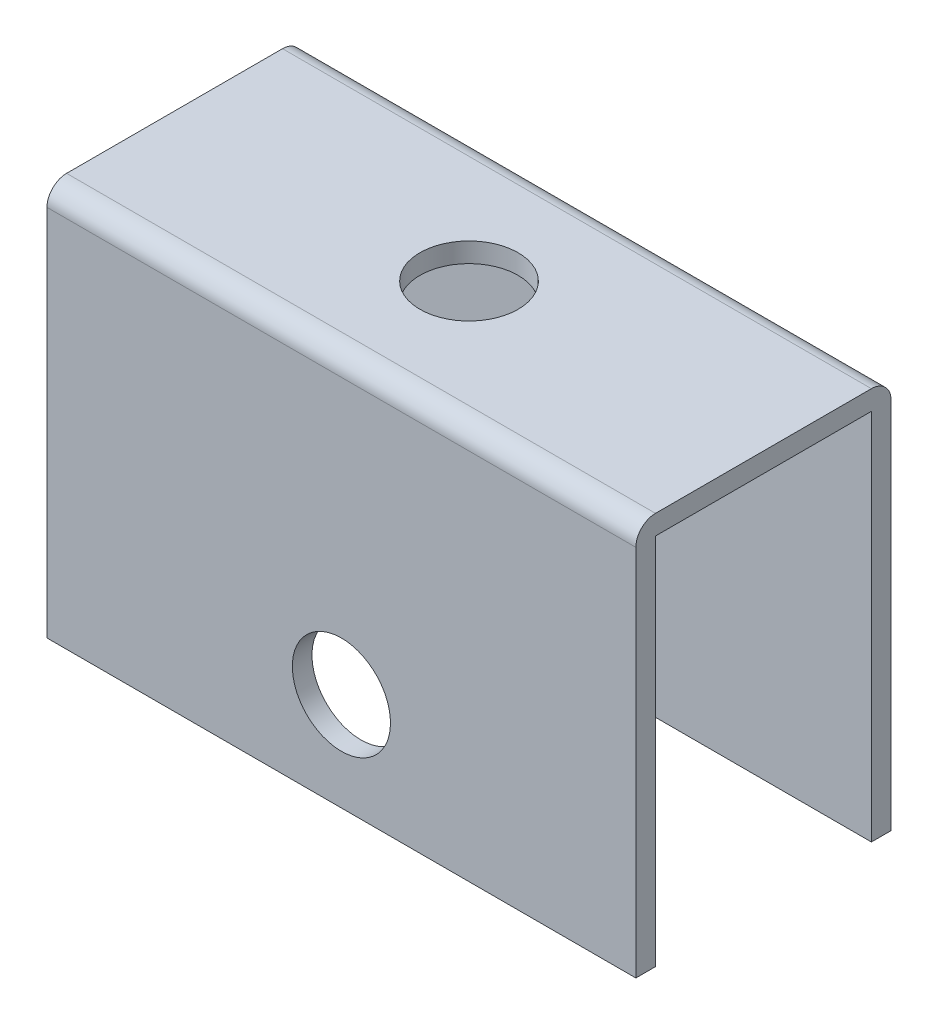
ISO-10303-21;
HEADER;
FILE_DESCRIPTION(('STEP AP214'),'2;1');
FILE_NAME('part.step','',(''),(''),'','','');
FILE_SCHEMA(('AUTOMOTIVE_DESIGN { 1 0 10303 214 1 1 1 1 }'));
ENDSEC;
DATA;
#1=APPLICATION_CONTEXT('core data for automotive mechanical design processes');
#2=APPLICATION_PROTOCOL_DEFINITION('international standard','automotive_design',2000,#1);
#3=PRODUCT_CONTEXT('',#1,'mechanical');
#4=PRODUCT('Part','Part','',(#3));
#5=PRODUCT_RELATED_PRODUCT_CATEGORY('part','',(#4));
#6=PRODUCT_DEFINITION_FORMATION('','',#4);
#7=PRODUCT_DEFINITION_CONTEXT('part definition',#1,'design');
#8=PRODUCT_DEFINITION('design','',#6,#7);
#9=PRODUCT_DEFINITION_SHAPE('','',#8);
#10=(LENGTH_UNIT() NAMED_UNIT(*) SI_UNIT(.MILLI.,.METRE.));
#11=(NAMED_UNIT(*) PLANE_ANGLE_UNIT() SI_UNIT($,.RADIAN.));
#12=(NAMED_UNIT(*) SI_UNIT($,.STERADIAN.) SOLID_ANGLE_UNIT());
#13=UNCERTAINTY_MEASURE_WITH_UNIT(LENGTH_MEASURE(1.E-05),#10,'distance_accuracy_value','');
#14=(GEOMETRIC_REPRESENTATION_CONTEXT(3) GLOBAL_UNCERTAINTY_ASSIGNED_CONTEXT((#13)) GLOBAL_UNIT_ASSIGNED_CONTEXT((#10,
#11,#12)) REPRESENTATION_CONTEXT('',''));
#15=CARTESIAN_POINT('',(0.,0.,0.));
#16=DIRECTION('',(0.,0.,1.));
#17=DIRECTION('',(1.,0.,0.));
#18=AXIS2_PLACEMENT_3D('',#15,#16,#17);
#19=CARTESIAN_POINT('',(-38.1,-25.4,33.02));
#20=DIRECTION('',(0.,1.,0.));
#21=DIRECTION('',(0.,0.,1.));
#22=AXIS2_PLACEMENT_3D('',#19,#20,#21);
#23=PLANE('',#22);
#24=DIRECTION('',(0.,0.,-1.));
#25=VECTOR('',#24,1.);
#26=CARTESIAN_POINT('',(-38.1,-25.4,33.02));
#27=LINE('',#26,#25);
#28=CARTESIAN_POINT('',(-38.1,-25.4,33.02));
#29=VERTEX_POINT('',#28);
#30=CARTESIAN_POINT('',(-38.1,-25.4,30.48));
#31=VERTEX_POINT('',#30);
#32=EDGE_CURVE('E215',#29,#31,#27,.T.);
#33=ORIENTED_EDGE('',*,*,#32,.T.);
#34=DIRECTION('',(1.,0.,0.));
#35=VECTOR('',#34,1.);
#36=CARTESIAN_POINT('',(-38.1,-25.4,30.48));
#37=LINE('',#36,#35);
#38=CARTESIAN_POINT('',(38.1,-25.4,30.48));
#39=VERTEX_POINT('',#38);
#40=EDGE_CURVE('E179',#31,#39,#37,.T.);
#41=ORIENTED_EDGE('',*,*,#40,.T.);
#42=DIRECTION('',(0.,0.,-1.));
#43=VECTOR('',#42,1.);
#44=CARTESIAN_POINT('',(38.1,-25.4,33.02));
#45=LINE('',#44,#43);
#46=CARTESIAN_POINT('',(38.1,-25.4,33.02));
#47=VERTEX_POINT('',#46);
#48=EDGE_CURVE('E211',#47,#39,#45,.T.);
#49=ORIENTED_EDGE('',*,*,#48,.F.);
#50=DIRECTION('',(1.,0.,0.));
#51=VECTOR('',#50,1.);
#52=CARTESIAN_POINT('',(-38.1,-25.4,33.02));
#53=LINE('',#52,#51);
#54=EDGE_CURVE('E199',#29,#47,#53,.T.);
#55=ORIENTED_EDGE('',*,*,#54,.F.);
#56=EDGE_LOOP('',(#33,#41,#49,#55));
#57=FACE_BOUND('',#56,.T.);
#58=ADVANCED_FACE('F47',(#57),#23,.F.);
#59=CARTESIAN_POINT('',(0.,-12.7,33.02));
#60=DIRECTION('',(0.,0.,-1.));
#61=DIRECTION('',(-1.,0.,0.));
#62=AXIS2_PLACEMENT_3D('',#59,#60,#61);
#63=CYLINDRICAL_SURFACE('',#62,6.35);
#64=CARTESIAN_POINT('',(0.,-12.7,30.48));
#65=DIRECTION('',(0.,0.,1.));
#66=DIRECTION('',(1.,0.,0.));
#67=AXIS2_PLACEMENT_3D('',#64,#65,#66);
#68=CIRCLE('',#67,6.35);
#69=CARTESIAN_POINT('',(6.35,-12.7,30.48));
#70=VERTEX_POINT('',#69);
#71=EDGE_CURVE('E178',#70,#70,#68,.T.);
#72=ORIENTED_EDGE('',*,*,#71,.F.);
#73=EDGE_LOOP('',(#72));
#74=FACE_BOUND('',#73,.T.);
#75=CARTESIAN_POINT('',(0.,-12.7,33.02));
#76=DIRECTION('',(0.,0.,1.));
#77=DIRECTION('',(1.,0.,0.));
#78=AXIS2_PLACEMENT_3D('',#75,#76,#77);
#79=CIRCLE('',#78,6.35);
#80=CARTESIAN_POINT('',(6.35,-12.7,33.02));
#81=VERTEX_POINT('',#80);
#82=EDGE_CURVE('E184',#81,#81,#79,.T.);
#83=ORIENTED_EDGE('',*,*,#82,.T.);
#84=EDGE_LOOP('',(#83));
#85=FACE_BOUND('',#84,.T.);
#86=ADVANCED_FACE('F339',(#74,#85),#63,.F.);
#87=CARTESIAN_POINT('',(0.,0.,33.02));
#88=DIRECTION('',(0.,0.,1.));
#89=DIRECTION('',(1.,0.,0.));
#90=AXIS2_PLACEMENT_3D('',#87,#88,#89);
#91=PLANE('',#90);
#92=DIRECTION('',(0.,1.,0.));
#93=VECTOR('',#92,1.);
#94=CARTESIAN_POINT('',(38.1,25.4,33.02));
#95=LINE('',#94,#93);
#96=CARTESIAN_POINT('',(38.1,22.86,33.02));
#97=VERTEX_POINT('',#96);
#98=EDGE_CURVE('E192',#47,#97,#95,.T.);
#99=ORIENTED_EDGE('',*,*,#98,.T.);
#100=DIRECTION('',(-1.,0.,0.));
#101=VECTOR('',#100,1.);
#102=CARTESIAN_POINT('',(-38.1,22.86,33.02));
#103=LINE('',#102,#101);
#104=CARTESIAN_POINT('',(-38.1,22.86,33.02));
#105=VERTEX_POINT('',#104);
#106=EDGE_CURVE('E11',#97,#105,#103,.T.);
#107=ORIENTED_EDGE('',*,*,#106,.T.);
#108=DIRECTION('',(0.,-1.,0.));
#109=VECTOR('',#108,1.);
#110=CARTESIAN_POINT('',(-38.1,25.4,33.02));
#111=LINE('',#110,#109);
#112=EDGE_CURVE('E195',#105,#29,#111,.T.);
#113=ORIENTED_EDGE('',*,*,#112,.T.);
#114=ORIENTED_EDGE('',*,*,#54,.T.);
#115=EDGE_LOOP('',(#99,#107,#113,#114));
#116=FACE_BOUND('',#115,.T.);
#117=ORIENTED_EDGE('',*,*,#82,.F.);
#118=EDGE_LOOP('',(#117));
#119=FACE_BOUND('',#118,.T.);
#120=ADVANCED_FACE('F345',(#116,#119),#91,.T.);
#121=CARTESIAN_POINT('',(0.,0.,0.));
#122=DIRECTION('',(0.,0.,1.));
#123=DIRECTION('',(1.,0.,0.));
#124=AXIS2_PLACEMENT_3D('',#121,#122,#123);
#125=PLANE('',#124);
#126=DIRECTION('',(0.,-1.,0.));
#127=VECTOR('',#126,1.);
#128=CARTESIAN_POINT('',(-38.1,25.4,0.));
#129=LINE('',#128,#127);
#130=CARTESIAN_POINT('',(-38.1,22.86,0.));
#131=VERTEX_POINT('',#130);
#132=CARTESIAN_POINT('',(-38.1,-25.4,0.));
#133=VERTEX_POINT('',#132);
#134=EDGE_CURVE('E205',#131,#133,#129,.T.);
#135=ORIENTED_EDGE('',*,*,#134,.F.);
#136=DIRECTION('',(-1.,0.,0.));
#137=VECTOR('',#136,1.);
#138=CARTESIAN_POINT('',(0.,22.86,0.));
#139=LINE('',#138,#137);
#140=CARTESIAN_POINT('',(38.1,22.86,0.));
#141=VERTEX_POINT('',#140);
#142=EDGE_CURVE('E71',#131,#141,#139,.F.);
#143=ORIENTED_EDGE('',*,*,#142,.T.);
#144=DIRECTION('',(0.,1.,0.));
#145=VECTOR('',#144,1.);
#146=CARTESIAN_POINT('',(38.1,25.4,0.));
#147=LINE('',#146,#145);
#148=CARTESIAN_POINT('',(38.1,-25.4,0.));
#149=VERTEX_POINT('',#148);
#150=EDGE_CURVE('E188',#149,#141,#147,.T.);
#151=ORIENTED_EDGE('',*,*,#150,.F.);
#152=DIRECTION('',(1.,0.,0.));
#153=VECTOR('',#152,1.);
#154=CARTESIAN_POINT('',(-38.1,-25.4,0.));
#155=LINE('',#154,#153);
#156=EDGE_CURVE('E196',#133,#149,#155,.T.);
#157=ORIENTED_EDGE('',*,*,#156,.F.);
#158=EDGE_LOOP('',(#135,#143,#151,#157));
#159=FACE_BOUND('',#158,.T.);
#160=CARTESIAN_POINT('',(0.,-12.7,0.));
#161=DIRECTION('',(0.,0.,1.));
#162=DIRECTION('',(1.,0.,0.));
#163=AXIS2_PLACEMENT_3D('',#160,#161,#162);
#164=CIRCLE('',#163,6.35);
#165=CARTESIAN_POINT('',(6.35,-12.7,0.));
#166=VERTEX_POINT('',#165);
#167=EDGE_CURVE('E183',#166,#166,#164,.T.);
#168=ORIENTED_EDGE('',*,*,#167,.T.);
#169=EDGE_LOOP('',(#168));
#170=FACE_BOUND('',#169,.T.);
#171=ADVANCED_FACE('F260',(#159,#170),#125,.F.);
#172=CARTESIAN_POINT('',(38.1,25.4,33.02));
#173=DIRECTION('',(-1.,0.,0.));
#174=DIRECTION('',(0.,-1.,0.));
#175=AXIS2_PLACEMENT_3D('',#172,#173,#174);
#176=PLANE('',#175);
#177=ORIENTED_EDGE('',*,*,#150,.T.);
#178=CARTESIAN_POINT('',(38.1,22.86,2.54));
#179=DIRECTION('',(-1.,0.,0.));
#180=DIRECTION('',(0.,-1.,0.));
#181=AXIS2_PLACEMENT_3D('',#178,#179,#180);
#182=CIRCLE('',#181,2.54);
#183=CARTESIAN_POINT('',(38.1,25.4,2.54));
#184=VERTEX_POINT('',#183);
#185=EDGE_CURVE('E56',#141,#184,#182,.F.);
#186=ORIENTED_EDGE('',*,*,#185,.T.);
#187=DIRECTION('',(0.,0.,-1.));
#188=VECTOR('',#187,1.);
#189=CARTESIAN_POINT('',(38.1,25.4,33.02));
#190=LINE('',#189,#188);
#191=CARTESIAN_POINT('',(38.1,25.4,30.48));
#192=VERTEX_POINT('',#191);
#193=EDGE_CURVE('E222',#192,#184,#190,.T.);
#194=ORIENTED_EDGE('',*,*,#193,.F.);
#195=CARTESIAN_POINT('',(38.1,22.86,30.48));
#196=DIRECTION('',(-1.,0.,0.));
#197=DIRECTION('',(0.,-1.,0.));
#198=AXIS2_PLACEMENT_3D('',#195,#196,#197);
#199=CIRCLE('',#198,2.54);
#200=EDGE_CURVE('E63',#192,#97,#199,.F.);
#201=ORIENTED_EDGE('',*,*,#200,.T.);
#202=ORIENTED_EDGE('',*,*,#98,.F.);
#203=ORIENTED_EDGE('',*,*,#48,.T.);
#204=DIRECTION('',(0.,-1.,0.));
#205=VECTOR('',#204,1.);
#206=CARTESIAN_POINT('',(38.1,22.86,30.48));
#207=LINE('',#206,#205);
#208=CARTESIAN_POINT('',(38.1,22.86,30.48));
#209=VERTEX_POINT('',#208);
#210=EDGE_CURVE('E164',#209,#39,#207,.T.);
#211=ORIENTED_EDGE('',*,*,#210,.F.);
#212=DIRECTION('',(0.,0.,1.));
#213=VECTOR('',#212,1.);
#214=CARTESIAN_POINT('',(38.1,22.86,2.54));
#215=LINE('',#214,#213);
#216=CARTESIAN_POINT('',(38.1,22.86,2.54));
#217=VERTEX_POINT('',#216);
#218=EDGE_CURVE('E160',#217,#209,#215,.T.);
#219=ORIENTED_EDGE('',*,*,#218,.F.);
#220=DIRECTION('',(0.,1.,0.));
#221=VECTOR('',#220,1.);
#222=CARTESIAN_POINT('',(38.1,-38.1,2.54));
#223=LINE('',#222,#221);
#224=CARTESIAN_POINT('',(38.1,-25.4,2.54));
#225=VERTEX_POINT('',#224);
#226=EDGE_CURVE('E135',#225,#217,#223,.T.);
#227=ORIENTED_EDGE('',*,*,#226,.F.);
#228=EDGE_CURVE('E202',#225,#149,#45,.T.);
#229=ORIENTED_EDGE('',*,*,#228,.T.);
#230=EDGE_LOOP('',(#177,#186,#194,#201,#202,#203,#211,#219,#227,#229));
#231=FACE_BOUND('',#230,.T.);
#232=ADVANCED_FACE('F251',(#231),#176,.F.);
#233=CARTESIAN_POINT('',(-38.1,25.4,33.02));
#234=DIRECTION('',(0.,-1.,0.));
#235=DIRECTION('',(0.,0.,-1.));
#236=AXIS2_PLACEMENT_3D('',#233,#234,#235);
#237=PLANE('',#236);
#238=CARTESIAN_POINT('',(0.,25.4,16.51));
#239=DIRECTION('',(0.,-1.,0.));
#240=DIRECTION('',(1.,0.,0.));
#241=AXIS2_PLACEMENT_3D('',#238,#239,#240);
#242=CIRCLE('',#241,6.35);
#243=CARTESIAN_POINT('',(6.35,25.4,16.51));
#244=VERTEX_POINT('',#243);
#245=EDGE_CURVE('E167',#244,#244,#242,.T.);
#246=ORIENTED_EDGE('',*,*,#245,.T.);
#247=EDGE_LOOP('',(#246));
#248=FACE_BOUND('',#247,.T.);
#249=ORIENTED_EDGE('',*,*,#193,.T.);
#250=DIRECTION('',(-1.,0.,0.));
#251=VECTOR('',#250,1.);
#252=CARTESIAN_POINT('',(-38.1,25.4,2.54));
#253=LINE('',#252,#251);
#254=CARTESIAN_POINT('',(-38.1,25.4,2.54));
#255=VERTEX_POINT('',#254);
#256=EDGE_CURVE('E235',#184,#255,#253,.T.);
#257=ORIENTED_EDGE('',*,*,#256,.T.);
#258=DIRECTION('',(0.,0.,-1.));
#259=VECTOR('',#258,1.);
#260=CARTESIAN_POINT('',(-38.1,25.4,33.02));
#261=LINE('',#260,#259);
#262=CARTESIAN_POINT('',(-38.1,25.4,30.48));
#263=VERTEX_POINT('',#262);
#264=EDGE_CURVE('E219',#263,#255,#261,.T.);
#265=ORIENTED_EDGE('',*,*,#264,.F.);
#266=DIRECTION('',(-1.,0.,0.));
#267=VECTOR('',#266,1.);
#268=CARTESIAN_POINT('',(38.1,25.4,30.48));
#269=LINE('',#268,#267);
#270=EDGE_CURVE('E226',#263,#192,#269,.F.);
#271=ORIENTED_EDGE('',*,*,#270,.T.);
#272=EDGE_LOOP('',(#249,#257,#265,#271));
#273=FACE_BOUND('',#272,.T.);
#274=ADVANCED_FACE('F255',(#248,#273),#237,.F.);
#275=CARTESIAN_POINT('',(-38.1,25.4,33.02));
#276=DIRECTION('',(1.,0.,0.));
#277=DIRECTION('',(0.,1.,0.));
#278=AXIS2_PLACEMENT_3D('',#275,#276,#277);
#279=PLANE('',#278);
#280=ORIENTED_EDGE('',*,*,#264,.T.);
#281=CARTESIAN_POINT('',(-38.1,22.86,2.54));
#282=DIRECTION('',(1.,0.,0.));
#283=DIRECTION('',(0.,1.,0.));
#284=AXIS2_PLACEMENT_3D('',#281,#282,#283);
#285=CIRCLE('',#284,2.54);
#286=EDGE_CURVE('E242',#255,#131,#285,.F.);
#287=ORIENTED_EDGE('',*,*,#286,.T.);
#288=ORIENTED_EDGE('',*,*,#134,.T.);
#289=CARTESIAN_POINT('',(-38.1,-25.4,2.54));
#290=VERTEX_POINT('',#289);
#291=EDGE_CURVE('E154',#290,#133,#27,.T.);
#292=ORIENTED_EDGE('',*,*,#291,.F.);
#293=DIRECTION('',(0.,1.,0.));
#294=VECTOR('',#293,1.);
#295=CARTESIAN_POINT('',(-38.1,-38.1,2.54));
#296=LINE('',#295,#294);
#297=CARTESIAN_POINT('',(-38.1,22.86,2.54));
#298=VERTEX_POINT('',#297);
#299=EDGE_CURVE('E132',#290,#298,#296,.T.);
#300=ORIENTED_EDGE('',*,*,#299,.T.);
#301=DIRECTION('',(0.,0.,1.));
#302=VECTOR('',#301,1.);
#303=CARTESIAN_POINT('',(-38.1,22.86,2.54));
#304=LINE('',#303,#302);
#305=CARTESIAN_POINT('',(-38.1,22.86,30.48));
#306=VERTEX_POINT('',#305);
#307=EDGE_CURVE('E141',#298,#306,#304,.T.);
#308=ORIENTED_EDGE('',*,*,#307,.T.);
#309=DIRECTION('',(0.,-1.,0.));
#310=VECTOR('',#309,1.);
#311=CARTESIAN_POINT('',(-38.1,22.86,30.48));
#312=LINE('',#311,#310);
#313=EDGE_CURVE('E156',#306,#31,#312,.T.);
#314=ORIENTED_EDGE('',*,*,#313,.T.);
#315=ORIENTED_EDGE('',*,*,#32,.F.);
#316=ORIENTED_EDGE('',*,*,#112,.F.);
#317=CARTESIAN_POINT('',(-38.1,22.86,30.48));
#318=DIRECTION('',(1.,0.,0.));
#319=DIRECTION('',(0.,1.,0.));
#320=AXIS2_PLACEMENT_3D('',#317,#318,#319);
#321=CIRCLE('',#320,2.54);
#322=EDGE_CURVE('E239',#105,#263,#321,.F.);
#323=ORIENTED_EDGE('',*,*,#322,.T.);
#324=EDGE_LOOP('',(#280,#287,#288,#292,#300,#308,#314,#315,#316,#323));
#325=FACE_BOUND('',#324,.T.);
#326=ADVANCED_FACE('F152',(#325),#279,.F.);
#327=ORIENTED_EDGE('',*,*,#228,.F.);
#328=DIRECTION('',(-1.,0.,0.));
#329=VECTOR('',#328,1.);
#330=CARTESIAN_POINT('',(-38.1,-25.4,2.54));
#331=LINE('',#330,#329);
#332=EDGE_CURVE('E175',#225,#290,#331,.T.);
#333=ORIENTED_EDGE('',*,*,#332,.T.);
#334=ORIENTED_EDGE('',*,*,#291,.T.);
#335=ORIENTED_EDGE('',*,*,#156,.T.);
#336=EDGE_LOOP('',(#327,#333,#334,#335));
#337=FACE_BOUND('',#336,.T.);
#338=ADVANCED_FACE('F264',(#337),#23,.F.);
#339=CARTESIAN_POINT('',(0.,-12.7,2.54));
#340=DIRECTION('',(0.,0.,-1.));
#341=DIRECTION('',(0.,1.,0.));
#342=AXIS2_PLACEMENT_3D('',#339,#340,#341);
#343=CIRCLE('',#342,6.35);
#344=CARTESIAN_POINT('',(0.,-6.35,2.54));
#345=VERTEX_POINT('',#344);
#346=EDGE_CURVE('E173',#345,#345,#343,.T.);
#347=ORIENTED_EDGE('',*,*,#346,.F.);
#348=EDGE_LOOP('',(#347));
#349=FACE_BOUND('',#348,.T.);
#350=ORIENTED_EDGE('',*,*,#167,.F.);
#351=EDGE_LOOP('',(#350));
#352=FACE_BOUND('',#351,.T.);
#353=ADVANCED_FACE('F348',(#349,#352),#63,.F.);
#354=CARTESIAN_POINT('',(-38.1,22.86,30.48));
#355=DIRECTION('',(0.,0.,1.));
#356=DIRECTION('',(1.,0.,0.));
#357=AXIS2_PLACEMENT_3D('',#354,#355,#356);
#358=PLANE('',#357);
#359=ORIENTED_EDGE('',*,*,#71,.T.);
#360=EDGE_LOOP('',(#359));
#361=FACE_BOUND('',#360,.T.);
#362=ORIENTED_EDGE('',*,*,#313,.F.);
#363=DIRECTION('',(1.,0.,0.));
#364=VECTOR('',#363,1.);
#365=CARTESIAN_POINT('',(-38.1,22.86,30.48));
#366=LINE('',#365,#364);
#367=EDGE_CURVE('E140',#306,#209,#366,.T.);
#368=ORIENTED_EDGE('',*,*,#367,.T.);
#369=ORIENTED_EDGE('',*,*,#210,.T.);
#370=ORIENTED_EDGE('',*,*,#40,.F.);
#371=EDGE_LOOP('',(#362,#368,#369,#370));
#372=FACE_BOUND('',#371,.T.);
#373=ADVANCED_FACE('F335',(#361,#372),#358,.F.);
#374=CARTESIAN_POINT('',(-38.1,-38.1,2.54));
#375=DIRECTION('',(0.,0.,-1.));
#376=DIRECTION('',(0.,1.,0.));
#377=AXIS2_PLACEMENT_3D('',#374,#375,#376);
#378=PLANE('',#377);
#379=ORIENTED_EDGE('',*,*,#346,.T.);
#380=EDGE_LOOP('',(#379));
#381=FACE_BOUND('',#380,.T.);
#382=ORIENTED_EDGE('',*,*,#226,.T.);
#383=DIRECTION('',(1.,0.,0.));
#384=VECTOR('',#383,1.);
#385=CARTESIAN_POINT('',(-38.1,22.86,2.54));
#386=LINE('',#385,#384);
#387=EDGE_CURVE('E128',#298,#217,#386,.T.);
#388=ORIENTED_EDGE('',*,*,#387,.F.);
#389=ORIENTED_EDGE('',*,*,#299,.F.);
#390=ORIENTED_EDGE('',*,*,#332,.F.);
#391=EDGE_LOOP('',(#382,#388,#389,#390));
#392=FACE_BOUND('',#391,.T.);
#393=ADVANCED_FACE('F130',(#381,#392),#378,.F.);
#394=CARTESIAN_POINT('',(-38.1,22.86,2.54));
#395=DIRECTION('',(0.,1.,0.));
#396=DIRECTION('',(-1.,0.,0.));
#397=AXIS2_PLACEMENT_3D('',#394,#395,#396);
#398=PLANE('',#397);
#399=CARTESIAN_POINT('',(0.,22.86,16.51));
#400=DIRECTION('',(0.,-1.,0.));
#401=DIRECTION('',(1.,0.,0.));
#402=AXIS2_PLACEMENT_3D('',#399,#400,#401);
#403=CIRCLE('',#402,6.35);
#404=CARTESIAN_POINT('',(6.35,22.86,16.51));
#405=VERTEX_POINT('',#404);
#406=EDGE_CURVE('E318',#405,#405,#403,.T.);
#407=ORIENTED_EDGE('',*,*,#406,.F.);
#408=EDGE_LOOP('',(#407));
#409=FACE_BOUND('',#408,.T.);
#410=ORIENTED_EDGE('',*,*,#218,.T.);
#411=ORIENTED_EDGE('',*,*,#367,.F.);
#412=ORIENTED_EDGE('',*,*,#307,.F.);
#413=ORIENTED_EDGE('',*,*,#387,.T.);
#414=EDGE_LOOP('',(#410,#411,#412,#413));
#415=FACE_BOUND('',#414,.T.);
#416=ADVANCED_FACE('F144',(#409,#415),#398,.F.);
#417=CARTESIAN_POINT('',(0.,25.4,16.51));
#418=DIRECTION('',(0.,-1.,0.));
#419=DIRECTION('',(1.,0.,0.));
#420=AXIS2_PLACEMENT_3D('',#417,#418,#419);
#421=CYLINDRICAL_SURFACE('',#420,6.35);
#422=ORIENTED_EDGE('',*,*,#245,.F.);
#423=EDGE_LOOP('',(#422));
#424=FACE_BOUND('',#423,.T.);
#425=ORIENTED_EDGE('',*,*,#406,.T.);
#426=EDGE_LOOP('',(#425));
#427=FACE_BOUND('',#426,.T.);
#428=ADVANCED_FACE('F325',(#424,#427),#421,.F.);
#429=CARTESIAN_POINT('',(-38.1,22.86,2.54));
#430=DIRECTION('',(-1.,0.,0.));
#431=DIRECTION('',(0.,0.,1.));
#432=AXIS2_PLACEMENT_3D('',#429,#430,#431);
#433=CYLINDRICAL_SURFACE('',#432,2.54);
#434=ORIENTED_EDGE('',*,*,#185,.F.);
#435=ORIENTED_EDGE('',*,*,#142,.F.);
#436=ORIENTED_EDGE('',*,*,#286,.F.);
#437=ORIENTED_EDGE('',*,*,#256,.F.);
#438=EDGE_LOOP('',(#434,#435,#436,#437));
#439=FACE_BOUND('',#438,.T.);
#440=ADVANCED_FACE('F258',(#439),#433,.T.);
#441=CARTESIAN_POINT('',(0.,22.86,30.48));
#442=DIRECTION('',(1.,0.,0.));
#443=DIRECTION('',(0.,0.,-1.));
#444=AXIS2_PLACEMENT_3D('',#441,#442,#443);
#445=CYLINDRICAL_SURFACE('',#444,2.54);
#446=ORIENTED_EDGE('',*,*,#200,.F.);
#447=ORIENTED_EDGE('',*,*,#270,.F.);
#448=ORIENTED_EDGE('',*,*,#322,.F.);
#449=ORIENTED_EDGE('',*,*,#106,.F.);
#450=EDGE_LOOP('',(#446,#447,#448,#449));
#451=FACE_BOUND('',#450,.T.);
#452=ADVANCED_FACE('F49',(#451),#445,.T.);
#453=CLOSED_SHELL('',(#58,#86,#120,#171,#232,#274,#326,#338,#353,#373,#393,#416,#428,#440,#452));
#454=MANIFOLD_SOLID_BREP('B2',#453);
#455=ADVANCED_BREP_SHAPE_REPRESENTATION('',(#18,#454),#14);
#456=SHAPE_DEFINITION_REPRESENTATION(#9,#455);
ENDSEC;
END-ISO-10303-21;
